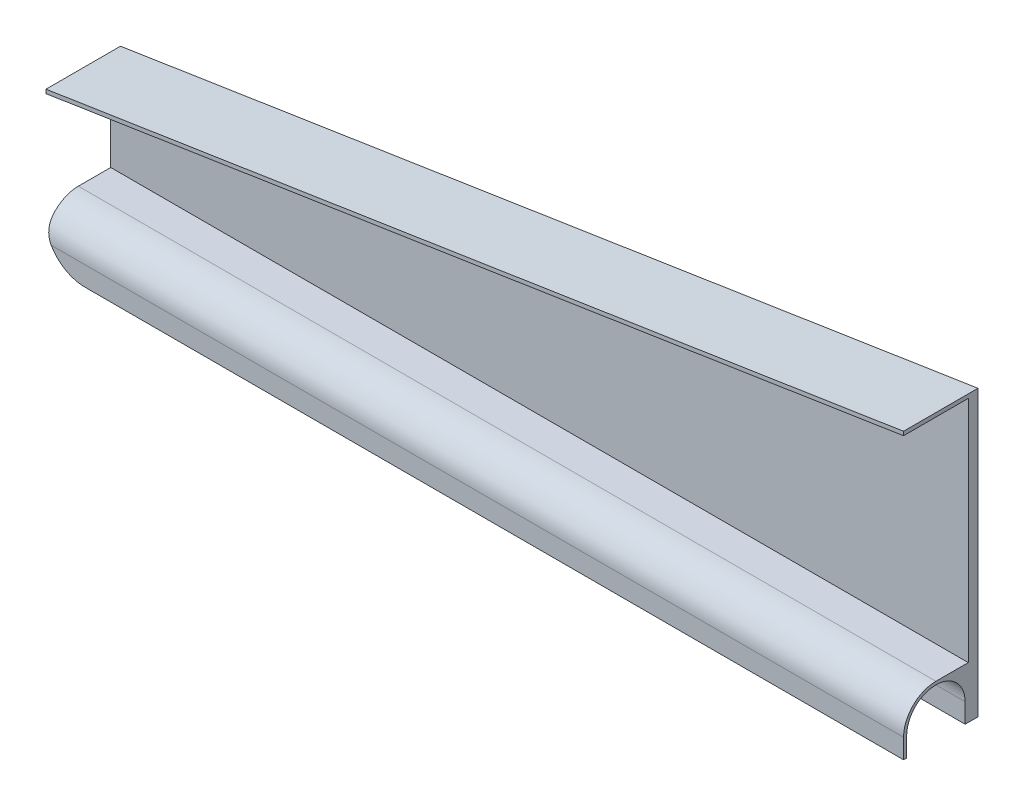
ISO-10303-21;
HEADER;
FILE_DESCRIPTION(('STEP AP214'),'2;1');
FILE_NAME('part.step','',(''),(''),'','','');
FILE_SCHEMA(('AUTOMOTIVE_DESIGN { 1 0 10303 214 1 1 1 1 }'));
ENDSEC;
DATA;
#1=APPLICATION_CONTEXT('core data for automotive mechanical design processes');
#2=APPLICATION_PROTOCOL_DEFINITION('international standard','automotive_design',2000,#1);
#3=PRODUCT_CONTEXT('',#1,'mechanical');
#4=PRODUCT('Part','Part','',(#3));
#5=PRODUCT_RELATED_PRODUCT_CATEGORY('part','',(#4));
#6=PRODUCT_DEFINITION_FORMATION('','',#4);
#7=PRODUCT_DEFINITION_CONTEXT('part definition',#1,'design');
#8=PRODUCT_DEFINITION('design','',#6,#7);
#9=PRODUCT_DEFINITION_SHAPE('','',#8);
#10=(LENGTH_UNIT() NAMED_UNIT(*) SI_UNIT(.MILLI.,.METRE.));
#11=(NAMED_UNIT(*) PLANE_ANGLE_UNIT() SI_UNIT($,.RADIAN.));
#12=(NAMED_UNIT(*) SI_UNIT($,.STERADIAN.) SOLID_ANGLE_UNIT());
#13=UNCERTAINTY_MEASURE_WITH_UNIT(LENGTH_MEASURE(1.E-05),#10,'distance_accuracy_value','');
#14=(GEOMETRIC_REPRESENTATION_CONTEXT(3) GLOBAL_UNCERTAINTY_ASSIGNED_CONTEXT((#13)) GLOBAL_UNIT_ASSIGNED_CONTEXT((#10,
#11,#12)) REPRESENTATION_CONTEXT('',''));
#15=CARTESIAN_POINT('',(0.,0.,0.));
#16=DIRECTION('',(0.,0.,1.));
#17=DIRECTION('',(1.,0.,0.));
#18=AXIS2_PLACEMENT_3D('',#15,#16,#17);
#19=CARTESIAN_POINT('',(-508.085110878234,0.,6.35));
#20=DIRECTION('',(-1.,0.,0.));
#21=DIRECTION('',(0.,0.,1.));
#22=AXIS2_PLACEMENT_3D('',#19,#20,#21);
#23=PLANE('',#22);
#24=DIRECTION('',(0.,0.,-1.));
#25=VECTOR('',#24,1.);
#26=CARTESIAN_POINT('',(-508.085110878234,-181.437945662038,6.35));
#27=LINE('',#26,#25);
#28=CARTESIAN_POINT('',(-508.085110878234,-181.437945662038,13.2329683428764));
#29=VERTEX_POINT('',#28);
#30=CARTESIAN_POINT('',(-508.085110878234,-181.437945662038,0.));
#31=VERTEX_POINT('',#30);
#32=EDGE_CURVE('E47',#29,#31,#27,.T.);
#33=ORIENTED_EDGE('',*,*,#32,.F.);
#34=CARTESIAN_POINT('',(-508.085110878234,-194.137945662038,27.432));
#35=DIRECTION('',(-1.,0.,0.));
#36=DIRECTION('',(0.,0.,1.));
#37=AXIS2_PLACEMENT_3D('',#34,#35,#36);
#38=CIRCLE('',#37,19.05);
#39=CARTESIAN_POINT('',(-508.085110878234,-181.437945662038,41.6310316571236));
#40=VERTEX_POINT('',#39);
#41=EDGE_CURVE('E156',#40,#29,#38,.T.);
#42=ORIENTED_EDGE('',*,*,#41,.F.);
#43=DIRECTION('',(0.,0.,-1.));
#44=VECTOR('',#43,1.);
#45=CARTESIAN_POINT('',(-508.085110878234,-181.437945662038,116.84));
#46=LINE('',#45,#44);
#47=CARTESIAN_POINT('',(-508.085110878234,-181.437945662038,44.2593801882527));
#48=VERTEX_POINT('',#47);
#49=EDGE_CURVE('E145',#48,#40,#46,.T.);
#50=ORIENTED_EDGE('',*,*,#49,.F.);
#51=CARTESIAN_POINT('',(-508.085110878234,-194.137945662038,27.432));
#52=DIRECTION('',(-1.,0.,0.));
#53=DIRECTION('',(0.,0.,1.));
#54=AXIS2_PLACEMENT_3D('',#51,#52,#53);
#55=CIRCLE('',#54,21.082);
#56=CARTESIAN_POINT('',(-508.085110878234,-173.055945662038,27.432));
#57=VERTEX_POINT('',#56);
#58=EDGE_CURVE('E153',#48,#57,#55,.T.);
#59=ORIENTED_EDGE('',*,*,#58,.T.);
#60=DIRECTION('',(0.,0.,1.));
#61=VECTOR('',#60,1.);
#62=CARTESIAN_POINT('',(-508.085110878234,-173.055945662038,0.));
#63=LINE('',#62,#61);
#64=CARTESIAN_POINT('',(-508.085110878234,-173.055945662038,6.35));
#65=VERTEX_POINT('',#64);
#66=EDGE_CURVE('E174',#65,#57,#63,.T.);
#67=ORIENTED_EDGE('',*,*,#66,.F.);
#68=DIRECTION('',(0.,1.,0.));
#69=VECTOR('',#68,1.);
#70=CARTESIAN_POINT('',(-508.085110878234,0.,6.35));
#71=LINE('',#70,#69);
#72=CARTESIAN_POINT('',(-508.085110878234,-110.317945662038,6.35));
#73=VERTEX_POINT('',#72);
#74=EDGE_CURVE('E195',#65,#73,#71,.T.);
#75=ORIENTED_EDGE('',*,*,#74,.T.);
#76=DIRECTION('',(0.,0.,-1.));
#77=VECTOR('',#76,1.);
#78=CARTESIAN_POINT('',(-508.085110878234,-110.317945662038,48.514));
#79=LINE('',#78,#77);
#80=CARTESIAN_POINT('',(-508.085110878234,-110.317945662038,48.514));
#81=VERTEX_POINT('',#80);
#82=EDGE_CURVE('E260',#81,#73,#79,.T.);
#83=ORIENTED_EDGE('',*,*,#82,.F.);
#84=DIRECTION('',(0.,-1.,0.));
#85=VECTOR('',#84,1.);
#86=CARTESIAN_POINT('',(-508.085110878234,-107.777945662038,48.514));
#87=LINE('',#86,#85);
#88=CARTESIAN_POINT('',(-508.085110878234,-107.777945662038,48.514));
#89=VERTEX_POINT('',#88);
#90=EDGE_CURVE('E236',#89,#81,#87,.T.);
#91=ORIENTED_EDGE('',*,*,#90,.F.);
#92=DIRECTION('',(0.,0.,1.));
#93=VECTOR('',#92,1.);
#94=CARTESIAN_POINT('',(-508.085110878234,-107.777945662038,0.));
#95=LINE('',#94,#93);
#96=CARTESIAN_POINT('',(-508.085110878234,-107.777945662038,0.));
#97=VERTEX_POINT('',#96);
#98=EDGE_CURVE('E219',#97,#89,#95,.T.);
#99=ORIENTED_EDGE('',*,*,#98,.F.);
#100=DIRECTION('',(0.,1.,0.));
#101=VECTOR('',#100,1.);
#102=CARTESIAN_POINT('',(-508.085110878234,0.,0.));
#103=LINE('',#102,#101);
#104=EDGE_CURVE('E163',#31,#97,#103,.T.);
#105=ORIENTED_EDGE('',*,*,#104,.F.);
#106=EDGE_LOOP('',(#33,#42,#50,#59,#67,#75,#83,#91,#99,#105));
#107=FACE_BOUND('',#106,.T.);
#108=ADVANCED_FACE('F34',(#107),#23,.T.);
#109=CARTESIAN_POINT('',(0.,-206.837945662038,6.35));
#110=DIRECTION('',(0.,1.,0.));
#111=DIRECTION('',(-1.,0.,0.));
#112=AXIS2_PLACEMENT_3D('',#109,#110,#111);
#113=PLANE('',#112);
#114=DIRECTION('',(1.,0.,0.));
#115=VECTOR('',#114,1.);
#116=CARTESIAN_POINT('',(-562.11312601853,-206.837945662038,8.38199999999999));
#117=LINE('',#116,#115);
#118=CARTESIAN_POINT('',(-482.685110878234,-206.837945662038,8.38199999999999));
#119=VERTEX_POINT('',#118);
#120=CARTESIAN_POINT('',(50.7148891217656,-206.837945662038,8.38199999999999));
#121=VERTEX_POINT('',#120);
#122=EDGE_CURVE('E179',#119,#121,#117,.T.);
#123=ORIENTED_EDGE('',*,*,#122,.F.);
#124=DIRECTION('',(0.,0.,-1.));
#125=VECTOR('',#124,1.);
#126=CARTESIAN_POINT('',(-482.685110878234,-206.837945662038,6.35));
#127=LINE('',#126,#125);
#128=CARTESIAN_POINT('',(-482.685110878234,-206.837945662038,0.));
#129=VERTEX_POINT('',#128);
#130=EDGE_CURVE('E212',#119,#129,#127,.T.);
#131=ORIENTED_EDGE('',*,*,#130,.T.);
#132=DIRECTION('',(1.,0.,0.));
#133=VECTOR('',#132,1.);
#134=CARTESIAN_POINT('',(0.,-206.837945662038,0.));
#135=LINE('',#134,#133);
#136=CARTESIAN_POINT('',(50.7148891217656,-206.837945662038,0.));
#137=VERTEX_POINT('',#136);
#138=EDGE_CURVE('E204',#129,#137,#135,.T.);
#139=ORIENTED_EDGE('',*,*,#138,.T.);
#140=DIRECTION('',(0.,0.,-1.));
#141=VECTOR('',#140,1.);
#142=CARTESIAN_POINT('',(50.7148891217656,-206.837945662038,6.35));
#143=LINE('',#142,#141);
#144=EDGE_CURVE('E210',#121,#137,#143,.T.);
#145=ORIENTED_EDGE('',*,*,#144,.F.);
#146=EDGE_LOOP('',(#123,#131,#139,#145));
#147=FACE_BOUND('',#146,.T.);
#148=ADVANCED_FACE('F228',(#147),#113,.F.);
#149=CARTESIAN_POINT('',(0.,0.,6.35));
#150=DIRECTION('',(0.,0.,1.));
#151=DIRECTION('',(1.,0.,0.));
#152=AXIS2_PLACEMENT_3D('',#149,#150,#151);
#153=PLANE('',#152);
#154=DIRECTION('',(0.,-1.,0.));
#155=VECTOR('',#154,1.);
#156=CARTESIAN_POINT('',(50.7148891217656,0.,6.35));
#157=LINE('',#156,#155);
#158=CARTESIAN_POINT('',(50.7148891217656,-23.9579456620378,6.35));
#159=VERTEX_POINT('',#158);
#160=CARTESIAN_POINT('',(50.7148891217656,-173.055945662038,6.35));
#161=VERTEX_POINT('',#160);
#162=EDGE_CURVE('E198',#159,#161,#157,.T.);
#163=ORIENTED_EDGE('',*,*,#162,.F.);
#164=DIRECTION('',(0.988267602905192,0.15273226590353,0.));
#165=VECTOR('',#164,1.);
#166=CARTESIAN_POINT('',(-508.085110878234,-110.317945662038,6.35));
#167=LINE('',#166,#165);
#168=EDGE_CURVE('E234',#73,#159,#167,.T.);
#169=ORIENTED_EDGE('',*,*,#168,.F.);
#170=ORIENTED_EDGE('',*,*,#74,.F.);
#171=DIRECTION('',(1.,0.,0.));
#172=VECTOR('',#171,1.);
#173=CARTESIAN_POINT('',(-562.11312601853,-173.055945662038,6.35));
#174=LINE('',#173,#172);
#175=EDGE_CURVE('E176',#65,#161,#174,.T.);
#176=ORIENTED_EDGE('',*,*,#175,.T.);
#177=EDGE_LOOP('',(#163,#169,#170,#176));
#178=FACE_BOUND('',#177,.T.);
#179=ADVANCED_FACE('F327',(#178),#153,.T.);
#180=CARTESIAN_POINT('',(-482.685110878234,-181.437945662038,6.35));
#181=DIRECTION('',(0.,0.,-1.));
#182=DIRECTION('',(-1.,0.,0.));
#183=AXIS2_PLACEMENT_3D('',#180,#181,#182);
#184=CYLINDRICAL_SURFACE('',#183,25.4);
#185=CARTESIAN_POINT('',(-482.685110878234,-181.437945662038,0.));
#186=DIRECTION('',(0.,0.,1.));
#187=DIRECTION('',(1.,0.,0.));
#188=AXIS2_PLACEMENT_3D('',#185,#186,#187);
#189=CIRCLE('',#188,25.4);
#190=EDGE_CURVE('E167',#129,#31,#189,.F.);
#191=ORIENTED_EDGE('',*,*,#190,.F.);
#192=ORIENTED_EDGE('',*,*,#130,.F.);
#193=CARTESIAN_POINT('',(-482.685110878234,-181.437945662038,8.38199999999997));
#194=DIRECTION('',(0.,0.,-1.));
#195=DIRECTION('',(0.,1.,0.));
#196=AXIS2_PLACEMENT_3D('',#193,#194,#195);
#197=CIRCLE('',#196,25.4);
#198=CARTESIAN_POINT('',(-504.682156134359,-194.137945662038,8.38199999999999));
#199=VERTEX_POINT('',#198);
#200=EDGE_CURVE('E54',#199,#119,#197,.F.);
#201=ORIENTED_EDGE('',*,*,#200,.F.);
#202=CARTESIAN_POINT('',(-504.682156134359,-194.137945662038,8.38199999999999));
#203=CARTESIAN_POINT('',(-504.79720975601,-193.938670363744,8.38199960905063));
#204=CARTESIAN_POINT('',(-504.909542266543,-193.737845939561,8.38512760889851));
#205=CARTESIAN_POINT('',(-505.128637186274,-193.333366321374,8.39792245076879));
#206=CARTESIAN_POINT('',(-505.235399127924,-193.129710891571,8.40758984070479));
#207=CARTESIAN_POINT('',(-505.54716362878,-192.514842149194,8.44683038355515));
#208=CARTESIAN_POINT('',(-505.743584211063,-192.099831482841,8.48664220709793));
#209=CARTESIAN_POINT('',(-506.112042738039,-191.263790426877,8.59535665893664));
#210=CARTESIAN_POINT('',(-506.284124434883,-190.842772376236,8.66420617751531));
#211=CARTESIAN_POINT('',(-506.603660878553,-189.997560315258,8.83239535956349));
#212=CARTESIAN_POINT('',(-506.751120951007,-189.573367012519,8.93172841625499));
#213=CARTESIAN_POINT('',(-507.021774223212,-188.723977190887,9.16219407467895));
#214=CARTESIAN_POINT('',(-507.144873455938,-188.29878295229,9.29344561996288));
#215=CARTESIAN_POINT('',(-507.366489919966,-187.452985054512,9.58783164899344));
#216=CARTESIAN_POINT('',(-507.465003849174,-187.03238201923,9.75097041032528));
#217=CARTESIAN_POINT('',(-507.638319030903,-186.200084642028,10.1086673678386));
#218=CARTESIAN_POINT('',(-507.713136225676,-185.788384485069,10.3032043069566));
#219=CARTESIAN_POINT('',(-507.840627117345,-184.977510247968,10.7227990128837));
#220=CARTESIAN_POINT('',(-507.893306564792,-184.578332939824,10.9478488334835));
#221=CARTESIAN_POINT('',(-507.988863951516,-183.700528957711,11.4855929629348));
#222=CARTESIAN_POINT('',(-508.026251273516,-183.226161227395,11.8062970308383));
#223=CARTESIAN_POINT('',(-508.062339033711,-182.537588191789,12.318557161645));
#224=CARTESIAN_POINT('',(-508.071036658041,-182.311989671166,12.4944253237479));
#225=CARTESIAN_POINT('',(-508.082422361592,-181.868820448773,12.8562376613549));
#226=CARTESIAN_POINT('',(-508.085109770817,-181.651250644672,13.0421829578547));
#227=CARTESIAN_POINT('',(-508.085110878234,-181.437945662038,13.2329683428764));
#228=B_SPLINE_CURVE_WITH_KNOTS('',3,(#202,#203,#204,#205,#206,#207,#208,#209,#210,#211,#212,
#213,#214,#215,#216,#217,#218,#219,#220,#221,#222,#223,#224,#225,#226,#227),.UNSPECIFIED.,.F.,
.F.,(4,2,2,2,2,2,2,2,2,2,2,2,4),(0.,0.690227917147268,1.38051367334319,2.76144818206338,
4.13986785108374,5.51798898229213,6.90132653906519,8.28484979441021,9.66744028159059,
11.0496714016422,12.7677137040457,13.6259651289362,14.4843122237777),.UNSPECIFIED.);
#229=EDGE_CURVE('E216',#199,#29,#228,.T.);
#230=ORIENTED_EDGE('',*,*,#229,.T.);
#231=ORIENTED_EDGE('',*,*,#32,.T.);
#232=EDGE_LOOP('',(#191,#192,#201,#230,#231));
#233=FACE_BOUND('',#232,.T.);
#234=ADVANCED_FACE('F215',(#233),#184,.T.);
#235=CARTESIAN_POINT('',(50.7148891217656,0.,6.35));
#236=DIRECTION('',(1.,0.,0.));
#237=DIRECTION('',(0.,1.,0.));
#238=AXIS2_PLACEMENT_3D('',#235,#236,#237);
#239=PLANE('',#238);
#240=DIRECTION('',(0.,-1.,0.));
#241=VECTOR('',#240,1.);
#242=CARTESIAN_POINT('',(50.7148891217656,0.,0.));
#243=LINE('',#242,#241);
#244=CARTESIAN_POINT('',(50.7148891217656,-21.4179456620378,0.));
#245=VERTEX_POINT('',#244);
#246=EDGE_CURVE('E199',#245,#137,#243,.T.);
#247=ORIENTED_EDGE('',*,*,#246,.F.);
#248=DIRECTION('',(0.,0.,-1.));
#249=VECTOR('',#248,1.);
#250=CARTESIAN_POINT('',(50.7148891217656,-21.4179456620378,6.35));
#251=LINE('',#250,#249);
#252=CARTESIAN_POINT('',(50.7148891217656,-21.4179456620378,48.514));
#253=VERTEX_POINT('',#252);
#254=EDGE_CURVE('E200',#253,#245,#251,.T.);
#255=ORIENTED_EDGE('',*,*,#254,.F.);
#256=DIRECTION('',(0.,1.,0.));
#257=VECTOR('',#256,1.);
#258=CARTESIAN_POINT('',(50.7148891217656,-21.4179456620378,48.514));
#259=LINE('',#258,#257);
#260=CARTESIAN_POINT('',(50.7148891217656,-23.9579456620378,48.514));
#261=VERTEX_POINT('',#260);
#262=EDGE_CURVE('E251',#261,#253,#259,.T.);
#263=ORIENTED_EDGE('',*,*,#262,.F.);
#264=DIRECTION('',(0.,0.,-1.));
#265=VECTOR('',#264,1.);
#266=CARTESIAN_POINT('',(50.7148891217656,-23.9579456620378,48.514));
#267=LINE('',#266,#265);
#268=EDGE_CURVE('E256',#261,#159,#267,.T.);
#269=ORIENTED_EDGE('',*,*,#268,.T.);
#270=ORIENTED_EDGE('',*,*,#162,.T.);
#271=DIRECTION('',(0.,0.,1.));
#272=VECTOR('',#271,1.);
#273=CARTESIAN_POINT('',(50.7148891217656,-173.055945662038,0.));
#274=LINE('',#273,#272);
#275=CARTESIAN_POINT('',(50.7148891217656,-173.055945662038,27.432));
#276=VERTEX_POINT('',#275);
#277=EDGE_CURVE('E271',#161,#276,#274,.T.);
#278=ORIENTED_EDGE('',*,*,#277,.T.);
#279=CARTESIAN_POINT('',(50.7148891217656,-194.137945662038,27.432));
#280=DIRECTION('',(1.,0.,0.));
#281=DIRECTION('',(0.,0.,-1.));
#282=AXIS2_PLACEMENT_3D('',#279,#280,#281);
#283=CIRCLE('',#282,21.082);
#284=CARTESIAN_POINT('',(50.7148891217656,-194.137945662038,48.514));
#285=VERTEX_POINT('',#284);
#286=EDGE_CURVE('E193',#285,#276,#283,.F.);
#287=ORIENTED_EDGE('',*,*,#286,.F.);
#288=DIRECTION('',(0.,1.,0.));
#289=VECTOR('',#288,1.);
#290=CARTESIAN_POINT('',(50.7148891217656,0.,48.514));
#291=LINE('',#290,#289);
#292=CARTESIAN_POINT('',(50.7148891217656,-206.837945662038,48.514));
#293=VERTEX_POINT('',#292);
#294=EDGE_CURVE('E190',#293,#285,#291,.T.);
#295=ORIENTED_EDGE('',*,*,#294,.F.);
#296=DIRECTION('',(0.,0.,-1.));
#297=VECTOR('',#296,1.);
#298=CARTESIAN_POINT('',(50.7148891217656,-206.837945662038,0.));
#299=LINE('',#298,#297);
#300=CARTESIAN_POINT('',(50.7148891217656,-206.837945662038,46.482));
#301=VERTEX_POINT('',#300);
#302=EDGE_CURVE('E268',#293,#301,#299,.T.);
#303=ORIENTED_EDGE('',*,*,#302,.T.);
#304=DIRECTION('',(0.,1.,0.));
#305=VECTOR('',#304,1.);
#306=CARTESIAN_POINT('',(50.7148891217656,0.,46.4820000000001));
#307=LINE('',#306,#305);
#308=CARTESIAN_POINT('',(50.7148891217656,-194.137945662038,46.482));
#309=VERTEX_POINT('',#308);
#310=EDGE_CURVE('E170',#301,#309,#307,.T.);
#311=ORIENTED_EDGE('',*,*,#310,.T.);
#312=CARTESIAN_POINT('',(50.7148891217656,-194.137945662038,27.432));
#313=DIRECTION('',(1.,0.,0.));
#314=DIRECTION('',(0.,0.,-1.));
#315=AXIS2_PLACEMENT_3D('',#312,#313,#314);
#316=CIRCLE('',#315,19.05);
#317=CARTESIAN_POINT('',(50.7148891217656,-194.137945662038,8.38199999999999));
#318=VERTEX_POINT('',#317);
#319=EDGE_CURVE('E164',#309,#318,#316,.F.);
#320=ORIENTED_EDGE('',*,*,#319,.T.);
#321=DIRECTION('',(0.,1.,0.));
#322=VECTOR('',#321,1.);
#323=CARTESIAN_POINT('',(50.7148891217656,0.,8.38199999999988));
#324=LINE('',#323,#322);
#325=EDGE_CURVE('E181',#121,#318,#324,.T.);
#326=ORIENTED_EDGE('',*,*,#325,.F.);
#327=ORIENTED_EDGE('',*,*,#144,.T.);
#328=EDGE_LOOP('',(#247,#255,#263,#269,#270,#278,#287,#295,#303,#311,#320,#326,#327));
#329=FACE_BOUND('',#328,.T.);
#330=ADVANCED_FACE('F335',(#329),#239,.T.);
#331=CARTESIAN_POINT('',(0.,0.,0.));
#332=DIRECTION('',(0.,0.,1.));
#333=DIRECTION('',(1.,0.,0.));
#334=AXIS2_PLACEMENT_3D('',#331,#332,#333);
#335=PLANE('',#334);
#336=ORIENTED_EDGE('',*,*,#104,.T.);
#337=DIRECTION('',(0.988267602905192,0.15273226590353,0.));
#338=VECTOR('',#337,1.);
#339=CARTESIAN_POINT('',(-508.085110878234,-107.777945662038,0.));
#340=LINE('',#339,#338);
#341=EDGE_CURVE('E262',#97,#245,#340,.T.);
#342=ORIENTED_EDGE('',*,*,#341,.T.);
#343=ORIENTED_EDGE('',*,*,#246,.T.);
#344=ORIENTED_EDGE('',*,*,#138,.F.);
#345=ORIENTED_EDGE('',*,*,#190,.T.);
#346=EDGE_LOOP('',(#336,#342,#343,#344,#345));
#347=FACE_BOUND('',#346,.T.);
#348=ADVANCED_FACE('F223',(#347),#335,.F.);
#349=CARTESIAN_POINT('',(-562.11312601853,-173.055945662038,0.));
#350=DIRECTION('',(0.,1.,0.));
#351=DIRECTION('',(0.,0.,1.));
#352=AXIS2_PLACEMENT_3D('',#349,#350,#351);
#353=PLANE('',#352);
#354=ORIENTED_EDGE('',*,*,#175,.F.);
#355=ORIENTED_EDGE('',*,*,#66,.T.);
#356=DIRECTION('',(1.,0.,0.));
#357=VECTOR('',#356,1.);
#358=CARTESIAN_POINT('',(-562.11312601853,-173.055945662038,27.432));
#359=LINE('',#358,#357);
#360=EDGE_CURVE('E161',#57,#276,#359,.T.);
#361=ORIENTED_EDGE('',*,*,#360,.T.);
#362=ORIENTED_EDGE('',*,*,#277,.F.);
#363=EDGE_LOOP('',(#354,#355,#361,#362));
#364=FACE_BOUND('',#363,.T.);
#365=ADVANCED_FACE('F345',(#364),#353,.T.);
#366=CARTESIAN_POINT('',(-562.11312601853,0.,8.38199999999988));
#367=DIRECTION('',(0.,0.,-1.));
#368=DIRECTION('',(0.,1.,0.));
#369=AXIS2_PLACEMENT_3D('',#366,#367,#368);
#370=PLANE('',#369);
#371=DIRECTION('',(1.,0.,0.));
#372=VECTOR('',#371,1.);
#373=CARTESIAN_POINT('',(-562.11312601853,-194.137945662038,8.38199999999999));
#374=LINE('',#373,#372);
#375=EDGE_CURVE('E182',#199,#318,#374,.T.);
#376=ORIENTED_EDGE('',*,*,#375,.F.);
#377=ORIENTED_EDGE('',*,*,#200,.T.);
#378=ORIENTED_EDGE('',*,*,#122,.T.);
#379=ORIENTED_EDGE('',*,*,#325,.T.);
#380=EDGE_LOOP('',(#376,#377,#378,#379));
#381=FACE_BOUND('',#380,.T.);
#382=ADVANCED_FACE('F232',(#381),#370,.F.);
#383=CARTESIAN_POINT('',(-562.11312601853,-194.137945662038,27.432));
#384=DIRECTION('',(1.,0.,0.));
#385=DIRECTION('',(0.,0.,-1.));
#386=AXIS2_PLACEMENT_3D('',#383,#384,#385);
#387=CYLINDRICAL_SURFACE('',#386,19.05);
#388=ORIENTED_EDGE('',*,*,#229,.F.);
#389=ORIENTED_EDGE('',*,*,#375,.T.);
#390=ORIENTED_EDGE('',*,*,#319,.F.);
#391=DIRECTION('',(1.,0.,0.));
#392=VECTOR('',#391,1.);
#393=CARTESIAN_POINT('',(-562.11312601853,-194.137945662038,46.482));
#394=LINE('',#393,#392);
#395=CARTESIAN_POINT('',(-504.682156134359,-194.137945662038,46.482));
#396=VERTEX_POINT('',#395);
#397=EDGE_CURVE('E184',#396,#309,#394,.T.);
#398=ORIENTED_EDGE('',*,*,#397,.F.);
#399=CARTESIAN_POINT('',(-508.085110878234,-181.437945662038,41.6310316571236));
#400=CARTESIAN_POINT('',(-508.085110853028,-181.60945252099,41.7844328099501));
#401=CARTESIAN_POINT('',(-508.083373348191,-181.783723997483,41.9347107388957));
#402=CARTESIAN_POINT('',(-508.076090964915,-182.137557457659,42.2288281334745));
#403=CARTESIAN_POINT('',(-508.070545855066,-182.317119762261,42.3726672072151));
#404=CARTESIAN_POINT('',(-508.047697829708,-182.863422146816,42.7942640423852));
#405=CARTESIAN_POINT('',(-508.024181965592,-183.237712354122,43.0620429883658));
#406=CARTESIAN_POINT('',(-507.958184168992,-184.002905967128,43.5687209328664));
#407=CARTESIAN_POINT('',(-507.915731173468,-184.393783205462,43.8076632901387));
#408=CARTESIAN_POINT('',(-507.809738556414,-185.189492229823,44.2556757282683));
#409=CARTESIAN_POINT('',(-507.746202856225,-185.594321408278,44.4647513539433));
#410=CARTESIAN_POINT('',(-507.596050115694,-186.415906139081,44.8526691516433));
#411=CARTESIAN_POINT('',(-507.509350866137,-186.832699355812,45.0313998580509));
#412=CARTESIAN_POINT('',(-507.31174018432,-187.67296092858,45.3571091057461));
#413=CARTESIAN_POINT('',(-507.200825966186,-188.096430047457,45.5040839897298));
#414=CARTESIAN_POINT('',(-506.954221881208,-188.945644371535,45.7661154534158));
#415=CARTESIAN_POINT('',(-506.818551018047,-189.371387589415,45.8811963460616));
#416=CARTESIAN_POINT('',(-506.522369820378,-190.221322496853,46.0801399942699));
#417=CARTESIAN_POINT('',(-506.361865963714,-190.645514561583,46.16401087179));
#418=CARTESIAN_POINT('',(-505.97435007336,-191.591354382813,46.3184801878725));
#419=CARTESIAN_POINT('',(-505.740653370124,-192.111643085528,46.3809045766854));
#420=CARTESIAN_POINT('',(-505.36334297739,-192.880826831807,46.4422190001803));
#421=CARTESIAN_POINT('',(-505.233166744518,-193.135251560675,46.4572705288326));
#422=CARTESIAN_POINT('',(-504.964118338946,-193.639894845376,46.4771611036847));
#423=CARTESIAN_POINT('',(-504.825245525546,-193.890113089577,46.4819993965328));
#424=CARTESIAN_POINT('',(-504.682156134359,-194.137945662038,46.482));
#425=B_SPLINE_CURVE_WITH_KNOTS('',3,(#399,#400,#401,#402,#403,#404,#405,#406,#407,#408,#409,
#410,#411,#412,#413,#414,#415,#416,#417,#418,#419,#420,#421,#422,#423,#424),.UNSPECIFIED.,.F.,
.F.,(4,2,2,2,2,2,2,2,2,2,2,2,4),(0.,0.69021297965438,1.38046791125707,2.7612399817614,
4.13990934730637,5.5183224265845,6.90169412584389,8.28522506257534,9.66769840772432,
11.0498117320456,12.7676853661981,13.6259672320179,14.4843124044433),.UNSPECIFIED.);
#426=EDGE_CURVE('E238',#40,#396,#425,.T.);
#427=ORIENTED_EDGE('',*,*,#426,.F.);
#428=ORIENTED_EDGE('',*,*,#41,.T.);
#429=EDGE_LOOP('',(#388,#389,#390,#398,#427,#428));
#430=FACE_BOUND('',#429,.T.);
#431=ADVANCED_FACE('F277',(#430),#387,.F.);
#432=CARTESIAN_POINT('',(-562.11312601853,0.,46.4820000000001));
#433=DIRECTION('',(0.,0.,-1.));
#434=DIRECTION('',(0.,1.,0.));
#435=AXIS2_PLACEMENT_3D('',#432,#433,#434);
#436=PLANE('',#435);
#437=CARTESIAN_POINT('',(-482.685110878234,-181.437945662038,46.482));
#438=DIRECTION('',(0.,0.,-1.));
#439=DIRECTION('',(0.,1.,0.));
#440=AXIS2_PLACEMENT_3D('',#437,#438,#439);
#441=CIRCLE('',#440,25.4);
#442=CARTESIAN_POINT('',(-482.685110878234,-206.837945662038,46.482));
#443=VERTEX_POINT('',#442);
#444=EDGE_CURVE('E281',#396,#443,#441,.F.);
#445=ORIENTED_EDGE('',*,*,#444,.F.);
#446=ORIENTED_EDGE('',*,*,#397,.T.);
#447=ORIENTED_EDGE('',*,*,#310,.F.);
#448=DIRECTION('',(1.,0.,0.));
#449=VECTOR('',#448,1.);
#450=CARTESIAN_POINT('',(-562.11312601853,-206.837945662038,46.482));
#451=LINE('',#450,#449);
#452=EDGE_CURVE('E186',#443,#301,#451,.T.);
#453=ORIENTED_EDGE('',*,*,#452,.F.);
#454=EDGE_LOOP('',(#445,#446,#447,#453));
#455=FACE_BOUND('',#454,.T.);
#456=ADVANCED_FACE('F316',(#455),#436,.T.);
#457=CARTESIAN_POINT('',(-562.11312601853,-206.837945662038,0.));
#458=DIRECTION('',(0.,-1.,0.));
#459=DIRECTION('',(0.,0.,-1.));
#460=AXIS2_PLACEMENT_3D('',#457,#458,#459);
#461=PLANE('',#460);
#462=DIRECTION('',(0.,0.,-1.));
#463=VECTOR('',#462,1.);
#464=CARTESIAN_POINT('',(-482.685110878234,-206.837945662038,116.84));
#465=LINE('',#464,#463);
#466=CARTESIAN_POINT('',(-482.685110878234,-206.837945662038,48.514));
#467=VERTEX_POINT('',#466);
#468=EDGE_CURVE('E157',#467,#443,#465,.T.);
#469=ORIENTED_EDGE('',*,*,#468,.T.);
#470=ORIENTED_EDGE('',*,*,#452,.T.);
#471=ORIENTED_EDGE('',*,*,#302,.F.);
#472=DIRECTION('',(1.,0.,0.));
#473=VECTOR('',#472,1.);
#474=CARTESIAN_POINT('',(-562.11312601853,-206.837945662038,48.514));
#475=LINE('',#474,#473);
#476=EDGE_CURVE('E188',#467,#293,#475,.T.);
#477=ORIENTED_EDGE('',*,*,#476,.F.);
#478=EDGE_LOOP('',(#469,#470,#471,#477));
#479=FACE_BOUND('',#478,.T.);
#480=ADVANCED_FACE('F313',(#479),#461,.T.);
#481=CARTESIAN_POINT('',(-562.11312601853,0.,48.514));
#482=DIRECTION('',(0.,0.,-1.));
#483=DIRECTION('',(-1.,0.,0.));
#484=AXIS2_PLACEMENT_3D('',#481,#482,#483);
#485=PLANE('',#484);
#486=DIRECTION('',(1.,0.,0.));
#487=VECTOR('',#486,1.);
#488=CARTESIAN_POINT('',(-562.11312601853,-194.137945662038,48.514));
#489=LINE('',#488,#487);
#490=CARTESIAN_POINT('',(-504.682156134359,-194.137945662038,48.514));
#491=VERTEX_POINT('',#490);
#492=EDGE_CURVE('E191',#491,#285,#489,.T.);
#493=ORIENTED_EDGE('',*,*,#492,.F.);
#494=CARTESIAN_POINT('',(-482.685110878234,-181.437945662038,48.514));
#495=DIRECTION('',(0.,0.,-1.));
#496=DIRECTION('',(-1.,0.,0.));
#497=AXIS2_PLACEMENT_3D('',#494,#495,#496);
#498=CIRCLE('',#497,25.4);
#499=EDGE_CURVE('E62',#491,#467,#498,.F.);
#500=ORIENTED_EDGE('',*,*,#499,.T.);
#501=ORIENTED_EDGE('',*,*,#476,.T.);
#502=ORIENTED_EDGE('',*,*,#294,.T.);
#503=EDGE_LOOP('',(#493,#500,#501,#502));
#504=FACE_BOUND('',#503,.T.);
#505=ADVANCED_FACE('F310',(#504),#485,.F.);
#506=CARTESIAN_POINT('',(-562.11312601853,-194.137945662038,27.432));
#507=DIRECTION('',(1.,0.,0.));
#508=DIRECTION('',(0.,0.,-1.));
#509=AXIS2_PLACEMENT_3D('',#506,#507,#508);
#510=CYLINDRICAL_SURFACE('',#509,21.082);
#511=ORIENTED_EDGE('',*,*,#58,.F.);
#512=CARTESIAN_POINT('',(-508.085110878234,-181.437945662038,44.2593801882527));
#513=CARTESIAN_POINT('',(-508.085111287121,-181.632534087238,44.4062416071743));
#514=CARTESIAN_POINT('',(-508.082874157615,-181.829653891055,44.5497120955761));
#515=CARTESIAN_POINT('',(-508.07358409758,-182.228685021162,44.8296910047859));
#516=CARTESIAN_POINT('',(-508.066530842612,-182.430596669373,44.9661989558952));
#517=CARTESIAN_POINT('',(-508.037632364961,-183.043152876425,45.3650319052063));
#518=CARTESIAN_POINT('',(-508.008048161098,-183.460541956862,45.6166080996458));
#519=CARTESIAN_POINT('',(-507.925870456253,-184.309484627351,46.0891129165484));
#520=CARTESIAN_POINT('',(-507.873303101312,-184.741021607986,46.3100759899847));
#521=CARTESIAN_POINT('',(-507.743172038085,-185.615111762006,46.7204691890038));
#522=CARTESIAN_POINT('',(-507.665613385298,-186.057662690683,46.9099056803673));
#523=CARTESIAN_POINT('',(-507.483710539201,-186.951391491008,47.2571041563406));
#524=CARTESIAN_POINT('',(-507.379278429399,-187.402593092205,47.4147590898683));
#525=CARTESIAN_POINT('',(-507.142838725814,-188.308062690582,47.6974427556528));
#526=CARTESIAN_POINT('',(-507.010826975798,-188.762331139938,47.8224665640275));
#527=CARTESIAN_POINT('',(-506.719156555622,-189.669055721659,48.0401752203894));
#528=CARTESIAN_POINT('',(-506.559532825654,-190.121513413846,48.132900497362));
#529=CARTESIAN_POINT('',(-506.212907553535,-191.021005121092,48.2873010695775));
#530=CARTESIAN_POINT('',(-506.025916119327,-191.468041072879,48.3489877913805));
#531=CARTESIAN_POINT('',(-505.653922255688,-192.290001072444,48.4363189836869));
#532=CARTESIAN_POINT('',(-505.472436829326,-192.66611984041,48.4658480508726));
#533=CARTESIAN_POINT('',(-505.090992917914,-193.409210057536,48.5046885524433));
#534=CARTESIAN_POINT('',(-504.891063616507,-193.776194829358,48.5140313741431));
#535=CARTESIAN_POINT('',(-504.682156134359,-194.137945662038,48.514));
#536=B_SPLINE_CURVE_WITH_KNOTS('',3,(#512,#513,#514,#515,#516,#517,#518,#519,#520,#521,#522,
#523,#524,#525,#526,#527,#528,#529,#530,#531,#532,#533,#534,#535),.UNSPECIFIED.,.F.,.F.,(4,2,2,
2,2,2,2,2,2,2,2,4),(0.,0.731271085460374,1.46259143802344,2.92551969856274,4.3867880187269,
5.84776092375242,7.31357554898584,8.77961123098987,10.2438051839465,11.7074597121903,
12.9624481638725,14.2154838428105),.UNSPECIFIED.);
#537=EDGE_CURVE('E11',#48,#491,#536,.T.);
#538=ORIENTED_EDGE('',*,*,#537,.T.);
#539=ORIENTED_EDGE('',*,*,#492,.T.);
#540=ORIENTED_EDGE('',*,*,#286,.T.);
#541=ORIENTED_EDGE('',*,*,#360,.F.);
#542=EDGE_LOOP('',(#511,#538,#539,#540,#541));
#543=FACE_BOUND('',#542,.T.);
#544=ADVANCED_FACE('F159',(#543),#510,.T.);
#545=CARTESIAN_POINT('',(-508.085110878234,-107.777945662038,0.));
#546=DIRECTION('',(0.15273226590353,-0.988267602905192,0.));
#547=DIRECTION('',(0.988267602905192,0.15273226590353,0.));
#548=AXIS2_PLACEMENT_3D('',#545,#546,#547);
#549=PLANE('',#548);
#550=ORIENTED_EDGE('',*,*,#98,.T.);
#551=DIRECTION('',(-0.988267602905192,-0.15273226590353,0.));
#552=VECTOR('',#551,1.);
#553=CARTESIAN_POINT('',(-508.085110878234,-107.777945662038,48.514));
#554=LINE('',#553,#552);
#555=EDGE_CURVE('E254',#253,#89,#554,.T.);
#556=ORIENTED_EDGE('',*,*,#555,.F.);
#557=ORIENTED_EDGE('',*,*,#254,.T.);
#558=ORIENTED_EDGE('',*,*,#341,.F.);
#559=EDGE_LOOP('',(#550,#556,#557,#558));
#560=FACE_BOUND('',#559,.T.);
#561=ADVANCED_FACE('F303',(#560),#549,.F.);
#562=CARTESIAN_POINT('',(-508.085110878234,-110.317945662038,48.514));
#563=DIRECTION('',(-0.15273226590353,0.988267602905192,0.));
#564=DIRECTION('',(-0.988267602905192,-0.15273226590353,0.));
#565=AXIS2_PLACEMENT_3D('',#562,#563,#564);
#566=PLANE('',#565);
#567=ORIENTED_EDGE('',*,*,#168,.T.);
#568=ORIENTED_EDGE('',*,*,#268,.F.);
#569=DIRECTION('',(0.988267602905192,0.15273226590353,0.));
#570=VECTOR('',#569,1.);
#571=CARTESIAN_POINT('',(-508.085110878234,-110.317945662038,48.514));
#572=LINE('',#571,#570);
#573=EDGE_CURVE('E249',#81,#261,#572,.T.);
#574=ORIENTED_EDGE('',*,*,#573,.F.);
#575=ORIENTED_EDGE('',*,*,#82,.T.);
#576=EDGE_LOOP('',(#567,#568,#574,#575));
#577=FACE_BOUND('',#576,.T.);
#578=ADVANCED_FACE('F299',(#577),#566,.F.);
#579=CARTESIAN_POINT('',(0.,0.,48.514));
#580=DIRECTION('',(0.,0.,1.));
#581=DIRECTION('',(1.,0.,0.));
#582=AXIS2_PLACEMENT_3D('',#579,#580,#581);
#583=PLANE('',#582);
#584=ORIENTED_EDGE('',*,*,#90,.T.);
#585=ORIENTED_EDGE('',*,*,#573,.T.);
#586=ORIENTED_EDGE('',*,*,#262,.T.);
#587=ORIENTED_EDGE('',*,*,#555,.T.);
#588=EDGE_LOOP('',(#584,#585,#586,#587));
#589=FACE_BOUND('',#588,.T.);
#590=ADVANCED_FACE('F294',(#589),#583,.T.);
#591=CARTESIAN_POINT('',(-482.685110878234,-181.437945662038,116.84));
#592=DIRECTION('',(0.,0.,-1.));
#593=DIRECTION('',(-1.,0.,0.));
#594=AXIS2_PLACEMENT_3D('',#591,#592,#593);
#595=CYLINDRICAL_SURFACE('',#594,25.4);
#596=ORIENTED_EDGE('',*,*,#426,.T.);
#597=ORIENTED_EDGE('',*,*,#444,.T.);
#598=ORIENTED_EDGE('',*,*,#468,.F.);
#599=ORIENTED_EDGE('',*,*,#499,.F.);
#600=ORIENTED_EDGE('',*,*,#537,.F.);
#601=ORIENTED_EDGE('',*,*,#49,.T.);
#602=EDGE_LOOP('',(#596,#597,#598,#599,#600,#601));
#603=FACE_BOUND('',#602,.T.);
#604=ADVANCED_FACE('F144',(#603),#595,.T.);
#605=CLOSED_SHELL('',(#108,#148,#179,#234,#330,#348,#365,#382,#431,#456,#480,#505,#544,#561,
#578,#590,#604));
#606=MANIFOLD_SOLID_BREP('B2',#605);
#607=ADVANCED_BREP_SHAPE_REPRESENTATION('',(#18,#606),#14);
#608=SHAPE_DEFINITION_REPRESENTATION(#9,#607);
ENDSEC;
END-ISO-10303-21;
